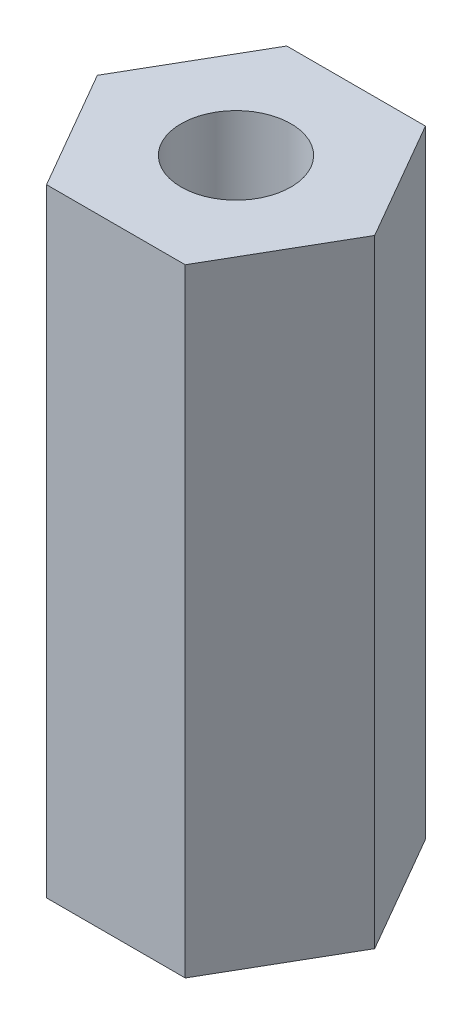
ISO-10303-21;
HEADER;
FILE_DESCRIPTION(('STEP AP214'),'2;1');
FILE_NAME('part.step','',(''),(''),'','','');
FILE_SCHEMA(('AUTOMOTIVE_DESIGN { 1 0 10303 214 1 1 1 1 }'));
ENDSEC;
DATA;
#1=APPLICATION_CONTEXT('core data for automotive mechanical design processes');
#2=APPLICATION_PROTOCOL_DEFINITION('international standard','automotive_design',2000,#1);
#3=PRODUCT_CONTEXT('',#1,'mechanical');
#4=PRODUCT('Part','Part','',(#3));
#5=PRODUCT_RELATED_PRODUCT_CATEGORY('part','',(#4));
#6=PRODUCT_DEFINITION_FORMATION('','',#4);
#7=PRODUCT_DEFINITION_CONTEXT('part definition',#1,'design');
#8=PRODUCT_DEFINITION('design','',#6,#7);
#9=PRODUCT_DEFINITION_SHAPE('','',#8);
#10=(LENGTH_UNIT() NAMED_UNIT(*) SI_UNIT(.MILLI.,.METRE.));
#11=(NAMED_UNIT(*) PLANE_ANGLE_UNIT() SI_UNIT($,.RADIAN.));
#12=(NAMED_UNIT(*) SI_UNIT($,.STERADIAN.) SOLID_ANGLE_UNIT());
#13=UNCERTAINTY_MEASURE_WITH_UNIT(LENGTH_MEASURE(1.E-05),#10,'distance_accuracy_value','');
#14=(GEOMETRIC_REPRESENTATION_CONTEXT(3) GLOBAL_UNCERTAINTY_ASSIGNED_CONTEXT((#13)) GLOBAL_UNIT_ASSIGNED_CONTEXT((#10,
#11,#12)) REPRESENTATION_CONTEXT('',''));
#15=CARTESIAN_POINT('',(0.,0.,0.));
#16=DIRECTION('',(0.,0.,1.));
#17=DIRECTION('',(1.,0.,0.));
#18=AXIS2_PLACEMENT_3D('',#15,#16,#17);
#19=CARTESIAN_POINT('',(0.,18.,0.));
#20=DIRECTION('',(0.,1.,0.));
#21=DIRECTION('',(0.,0.,1.));
#22=AXIS2_PLACEMENT_3D('',#19,#20,#21);
#23=PLANE('',#22);
#24=DIRECTION('',(0.5,0.,-0.866025403784439));
#25=VECTOR('',#24,1.);
#26=CARTESIAN_POINT('',(2.02072594216369,18.,3.5));
#27=LINE('',#26,#25);
#28=CARTESIAN_POINT('',(2.02072594216369,18.,3.5));
#29=VERTEX_POINT('',#28);
#30=CARTESIAN_POINT('',(4.04145188432738,18.,0.));
#31=VERTEX_POINT('',#30);
#32=EDGE_CURVE('E131',#29,#31,#27,.T.);
#33=ORIENTED_EDGE('',*,*,#32,.T.);
#34=DIRECTION('',(-0.5,0.,-0.866025403784439));
#35=VECTOR('',#34,1.);
#36=CARTESIAN_POINT('',(4.04145188432738,18.,0.));
#37=LINE('',#36,#35);
#38=CARTESIAN_POINT('',(2.02072594216369,18.,-3.5));
#39=VERTEX_POINT('',#38);
#40=EDGE_CURVE('E89',#31,#39,#37,.T.);
#41=ORIENTED_EDGE('',*,*,#40,.T.);
#42=DIRECTION('',(-1.,0.,0.));
#43=VECTOR('',#42,1.);
#44=CARTESIAN_POINT('',(2.02072594216369,18.,-3.5));
#45=LINE('',#44,#43);
#46=CARTESIAN_POINT('',(-2.02072594216369,18.,-3.5));
#47=VERTEX_POINT('',#46);
#48=EDGE_CURVE('E102',#39,#47,#45,.T.);
#49=ORIENTED_EDGE('',*,*,#48,.T.);
#50=DIRECTION('',(-0.5,0.,0.866025403784438));
#51=VECTOR('',#50,1.);
#52=CARTESIAN_POINT('',(-2.02072594216369,18.,-3.5));
#53=LINE('',#52,#51);
#54=CARTESIAN_POINT('',(-4.04145188432738,18.,0.));
#55=VERTEX_POINT('',#54);
#56=EDGE_CURVE('E96',#47,#55,#53,.T.);
#57=ORIENTED_EDGE('',*,*,#56,.T.);
#58=DIRECTION('',(0.5,0.,0.866025403784439));
#59=VECTOR('',#58,1.);
#60=CARTESIAN_POINT('',(-4.04145188432738,18.,0.));
#61=LINE('',#60,#59);
#62=CARTESIAN_POINT('',(-2.02072594216369,18.,3.5));
#63=VERTEX_POINT('',#62);
#64=EDGE_CURVE('E100',#55,#63,#61,.T.);
#65=ORIENTED_EDGE('',*,*,#64,.T.);
#66=DIRECTION('',(1.,0.,0.));
#67=VECTOR('',#66,1.);
#68=CARTESIAN_POINT('',(-2.02072594216369,18.,3.5));
#69=LINE('',#68,#67);
#70=EDGE_CURVE('E52',#63,#29,#69,.T.);
#71=ORIENTED_EDGE('',*,*,#70,.T.);
#72=EDGE_LOOP('',(#33,#41,#49,#57,#65,#71));
#73=FACE_BOUND('',#72,.T.);
#74=CARTESIAN_POINT('',(0.,18.,0.));
#75=DIRECTION('',(0.,1.,0.));
#76=DIRECTION('',(0.,0.,1.));
#77=AXIS2_PLACEMENT_3D('',#74,#75,#76);
#78=CIRCLE('',#77,1.6);
#79=CARTESIAN_POINT('',(0.,18.,1.6));
#80=VERTEX_POINT('',#79);
#81=EDGE_CURVE('E124',#80,#80,#78,.T.);
#82=ORIENTED_EDGE('',*,*,#81,.F.);
#83=EDGE_LOOP('',(#82));
#84=FACE_BOUND('',#83,.T.);
#85=ADVANCED_FACE('F35',(#73,#84),#23,.T.);
#86=CARTESIAN_POINT('',(0.,0.,0.));
#87=DIRECTION('',(0.,1.,0.));
#88=DIRECTION('',(0.,0.,1.));
#89=AXIS2_PLACEMENT_3D('',#86,#87,#88);
#90=PLANE('',#89);
#91=DIRECTION('',(0.5,0.,-0.866025403784439));
#92=VECTOR('',#91,1.);
#93=CARTESIAN_POINT('',(2.02072594216369,0.,3.5));
#94=LINE('',#93,#92);
#95=CARTESIAN_POINT('',(2.02072594216369,0.,3.5));
#96=VERTEX_POINT('',#95);
#97=CARTESIAN_POINT('',(4.04145188432738,0.,0.));
#98=VERTEX_POINT('',#97);
#99=EDGE_CURVE('E120',#96,#98,#94,.T.);
#100=ORIENTED_EDGE('',*,*,#99,.F.);
#101=DIRECTION('',(1.,0.,0.));
#102=VECTOR('',#101,1.);
#103=CARTESIAN_POINT('',(-2.02072594216369,0.,3.5));
#104=LINE('',#103,#102);
#105=CARTESIAN_POINT('',(-2.02072594216369,0.,3.5));
#106=VERTEX_POINT('',#105);
#107=EDGE_CURVE('E81',#106,#96,#104,.T.);
#108=ORIENTED_EDGE('',*,*,#107,.F.);
#109=DIRECTION('',(0.5,0.,0.866025403784439));
#110=VECTOR('',#109,1.);
#111=CARTESIAN_POINT('',(-4.04145188432738,0.,0.));
#112=LINE('',#111,#110);
#113=CARTESIAN_POINT('',(-4.04145188432738,0.,0.));
#114=VERTEX_POINT('',#113);
#115=EDGE_CURVE('E75',#114,#106,#112,.T.);
#116=ORIENTED_EDGE('',*,*,#115,.F.);
#117=DIRECTION('',(-0.5,0.,0.866025403784438));
#118=VECTOR('',#117,1.);
#119=CARTESIAN_POINT('',(-2.02072594216369,0.,-3.5));
#120=LINE('',#119,#118);
#121=CARTESIAN_POINT('',(-2.02072594216369,0.,-3.5));
#122=VERTEX_POINT('',#121);
#123=EDGE_CURVE('E110',#122,#114,#120,.T.);
#124=ORIENTED_EDGE('',*,*,#123,.F.);
#125=DIRECTION('',(-1.,0.,0.));
#126=VECTOR('',#125,1.);
#127=CARTESIAN_POINT('',(2.02072594216369,0.,-3.5));
#128=LINE('',#127,#126);
#129=CARTESIAN_POINT('',(2.02072594216369,0.,-3.5));
#130=VERTEX_POINT('',#129);
#131=EDGE_CURVE('E126',#130,#122,#128,.T.);
#132=ORIENTED_EDGE('',*,*,#131,.F.);
#133=DIRECTION('',(-0.5,0.,-0.866025403784439));
#134=VECTOR('',#133,1.);
#135=CARTESIAN_POINT('',(4.04145188432738,0.,0.));
#136=LINE('',#135,#134);
#137=EDGE_CURVE('E123',#98,#130,#136,.T.);
#138=ORIENTED_EDGE('',*,*,#137,.F.);
#139=EDGE_LOOP('',(#100,#108,#116,#124,#132,#138));
#140=FACE_BOUND('',#139,.T.);
#141=CARTESIAN_POINT('',(0.,0.,0.));
#142=DIRECTION('',(0.,1.,0.));
#143=DIRECTION('',(0.,0.,1.));
#144=AXIS2_PLACEMENT_3D('',#141,#142,#143);
#145=CIRCLE('',#144,1.6);
#146=CARTESIAN_POINT('',(0.,0.,1.6));
#147=VERTEX_POINT('',#146);
#148=EDGE_CURVE('E224',#147,#147,#145,.T.);
#149=ORIENTED_EDGE('',*,*,#148,.T.);
#150=EDGE_LOOP('',(#149));
#151=FACE_BOUND('',#150,.T.);
#152=ADVANCED_FACE('F140',(#140,#151),#90,.F.);
#153=CARTESIAN_POINT('',(2.02072594216369,18.,3.5));
#154=DIRECTION('',(-0.866025403784439,0.,-0.5));
#155=DIRECTION('',(-0.5,0.,0.866025403784439));
#156=AXIS2_PLACEMENT_3D('',#153,#154,#155);
#157=PLANE('',#156);
#158=ORIENTED_EDGE('',*,*,#99,.T.);
#159=DIRECTION('',(0.,-1.,0.));
#160=VECTOR('',#159,1.);
#161=CARTESIAN_POINT('',(4.04145188432738,18.,0.));
#162=LINE('',#161,#160);
#163=EDGE_CURVE('E11',#31,#98,#162,.T.);
#164=ORIENTED_EDGE('',*,*,#163,.F.);
#165=ORIENTED_EDGE('',*,*,#32,.F.);
#166=DIRECTION('',(0.,-1.,0.));
#167=VECTOR('',#166,1.);
#168=CARTESIAN_POINT('',(2.02072594216369,18.,3.5));
#169=LINE('',#168,#167);
#170=EDGE_CURVE('E116',#29,#96,#169,.T.);
#171=ORIENTED_EDGE('',*,*,#170,.T.);
#172=EDGE_LOOP('',(#158,#164,#165,#171));
#173=FACE_BOUND('',#172,.T.);
#174=ADVANCED_FACE('F37',(#173),#157,.F.);
#175=CARTESIAN_POINT('',(4.04145188432738,18.,0.));
#176=DIRECTION('',(-0.866025403784439,0.,0.5));
#177=DIRECTION('',(0.5,0.,0.866025403784439));
#178=AXIS2_PLACEMENT_3D('',#175,#176,#177);
#179=PLANE('',#178);
#180=ORIENTED_EDGE('',*,*,#137,.T.);
#181=DIRECTION('',(0.,-1.,0.));
#182=VECTOR('',#181,1.);
#183=CARTESIAN_POINT('',(2.02072594216369,18.,-3.5));
#184=LINE('',#183,#182);
#185=EDGE_CURVE('E44',#39,#130,#184,.T.);
#186=ORIENTED_EDGE('',*,*,#185,.F.);
#187=ORIENTED_EDGE('',*,*,#40,.F.);
#188=ORIENTED_EDGE('',*,*,#163,.T.);
#189=EDGE_LOOP('',(#180,#186,#187,#188));
#190=FACE_BOUND('',#189,.T.);
#191=ADVANCED_FACE('F165',(#190),#179,.F.);
#192=CARTESIAN_POINT('',(2.02072594216369,18.,-3.5));
#193=DIRECTION('',(0.,0.,1.));
#194=DIRECTION('',(1.,0.,0.));
#195=AXIS2_PLACEMENT_3D('',#192,#193,#194);
#196=PLANE('',#195);
#197=ORIENTED_EDGE('',*,*,#131,.T.);
#198=DIRECTION('',(0.,-1.,0.));
#199=VECTOR('',#198,1.);
#200=CARTESIAN_POINT('',(-2.02072594216369,18.,-3.5));
#201=LINE('',#200,#199);
#202=EDGE_CURVE('E111',#47,#122,#201,.T.);
#203=ORIENTED_EDGE('',*,*,#202,.F.);
#204=ORIENTED_EDGE('',*,*,#48,.F.);
#205=ORIENTED_EDGE('',*,*,#185,.T.);
#206=EDGE_LOOP('',(#197,#203,#204,#205));
#207=FACE_BOUND('',#206,.T.);
#208=ADVANCED_FACE('F137',(#207),#196,.F.);
#209=CARTESIAN_POINT('',(-2.02072594216369,18.,-3.5));
#210=DIRECTION('',(0.866025403784439,0.,0.5));
#211=DIRECTION('',(0.5,0.,-0.866025403784439));
#212=AXIS2_PLACEMENT_3D('',#209,#210,#211);
#213=PLANE('',#212);
#214=ORIENTED_EDGE('',*,*,#123,.T.);
#215=DIRECTION('',(0.,-1.,0.));
#216=VECTOR('',#215,1.);
#217=CARTESIAN_POINT('',(-4.04145188432738,18.,0.));
#218=LINE('',#217,#216);
#219=EDGE_CURVE('E107',#55,#114,#218,.T.);
#220=ORIENTED_EDGE('',*,*,#219,.F.);
#221=ORIENTED_EDGE('',*,*,#56,.F.);
#222=ORIENTED_EDGE('',*,*,#202,.T.);
#223=EDGE_LOOP('',(#214,#220,#221,#222));
#224=FACE_BOUND('',#223,.T.);
#225=ADVANCED_FACE('F108',(#224),#213,.F.);
#226=CARTESIAN_POINT('',(-4.04145188432738,18.,0.));
#227=DIRECTION('',(0.866025403784439,0.,-0.5));
#228=DIRECTION('',(-0.5,0.,-0.866025403784439));
#229=AXIS2_PLACEMENT_3D('',#226,#227,#228);
#230=PLANE('',#229);
#231=ORIENTED_EDGE('',*,*,#115,.T.);
#232=DIRECTION('',(0.,-1.,0.));
#233=VECTOR('',#232,1.);
#234=CARTESIAN_POINT('',(-2.02072594216369,18.,3.5));
#235=LINE('',#234,#233);
#236=EDGE_CURVE('E112',#63,#106,#235,.T.);
#237=ORIENTED_EDGE('',*,*,#236,.F.);
#238=ORIENTED_EDGE('',*,*,#64,.F.);
#239=ORIENTED_EDGE('',*,*,#219,.T.);
#240=EDGE_LOOP('',(#231,#237,#238,#239));
#241=FACE_BOUND('',#240,.T.);
#242=ADVANCED_FACE('F114',(#241),#230,.F.);
#243=CARTESIAN_POINT('',(-2.02072594216369,18.,3.5));
#244=DIRECTION('',(0.,0.,-1.));
#245=DIRECTION('',(-1.,0.,0.));
#246=AXIS2_PLACEMENT_3D('',#243,#244,#245);
#247=PLANE('',#246);
#248=ORIENTED_EDGE('',*,*,#107,.T.);
#249=ORIENTED_EDGE('',*,*,#170,.F.);
#250=ORIENTED_EDGE('',*,*,#70,.F.);
#251=ORIENTED_EDGE('',*,*,#236,.T.);
#252=EDGE_LOOP('',(#248,#249,#250,#251));
#253=FACE_BOUND('',#252,.T.);
#254=ADVANCED_FACE('F145',(#253),#247,.F.);
#255=CARTESIAN_POINT('',(0.,18.,0.));
#256=DIRECTION('',(0.,-1.,0.));
#257=DIRECTION('',(0.,0.,-1.));
#258=AXIS2_PLACEMENT_3D('',#255,#256,#257);
#259=CYLINDRICAL_SURFACE('',#258,1.6);
#260=ORIENTED_EDGE('',*,*,#81,.T.);
#261=EDGE_LOOP('',(#260));
#262=FACE_BOUND('',#261,.T.);
#263=ORIENTED_EDGE('',*,*,#148,.F.);
#264=EDGE_LOOP('',(#263));
#265=FACE_BOUND('',#264,.T.);
#266=ADVANCED_FACE('F147',(#262,#265),#259,.F.);
#267=CLOSED_SHELL('',(#85,#152,#174,#191,#208,#225,#242,#254,#266));
#268=MANIFOLD_SOLID_BREP('B2',#267);
#269=ADVANCED_BREP_SHAPE_REPRESENTATION('',(#18,#268),#14);
#270=SHAPE_DEFINITION_REPRESENTATION(#9,#269);
ENDSEC;
END-ISO-10303-21;
